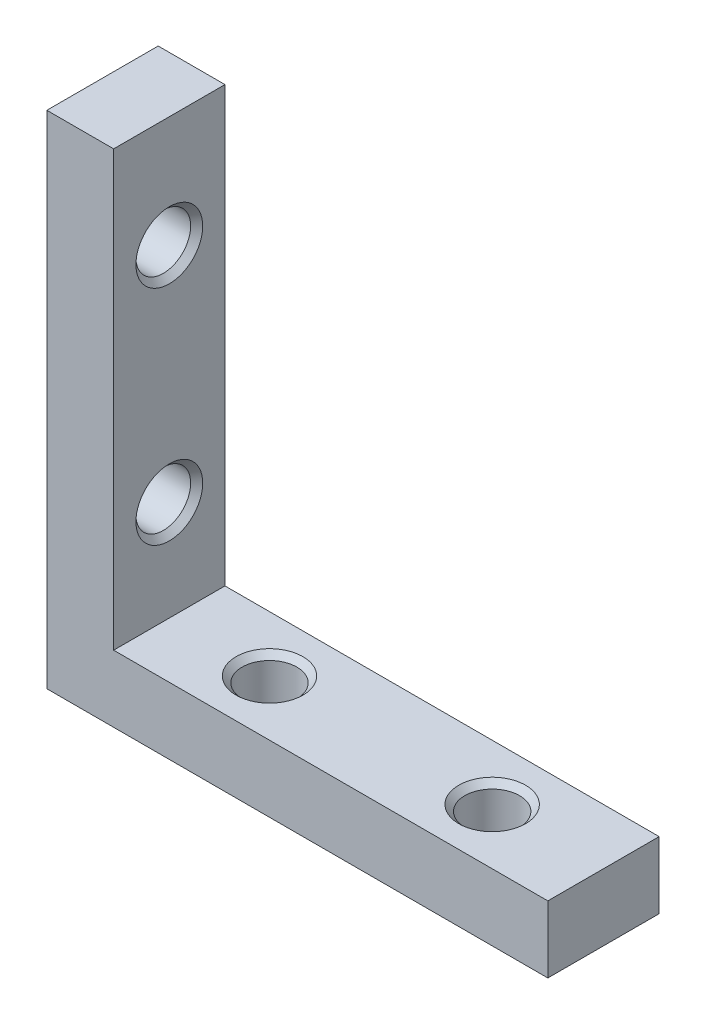
ISO-10303-21;
HEADER;
FILE_DESCRIPTION(('STEP AP214'),'2;1');
FILE_NAME('part.step','',(''),(''),'','','');
FILE_SCHEMA(('AUTOMOTIVE_DESIGN { 1 0 10303 214 1 1 1 1 }'));
ENDSEC;
DATA;
#1=APPLICATION_CONTEXT('core data for automotive mechanical design processes');
#2=APPLICATION_PROTOCOL_DEFINITION('international standard','automotive_design',2000,#1);
#3=PRODUCT_CONTEXT('',#1,'mechanical');
#4=PRODUCT('Part','Part','',(#3));
#5=PRODUCT_RELATED_PRODUCT_CATEGORY('part','',(#4));
#6=PRODUCT_DEFINITION_FORMATION('','',#4);
#7=PRODUCT_DEFINITION_CONTEXT('part definition',#1,'design');
#8=PRODUCT_DEFINITION('design','',#6,#7);
#9=PRODUCT_DEFINITION_SHAPE('','',#8);
#10=(LENGTH_UNIT() NAMED_UNIT(*) SI_UNIT(.MILLI.,.METRE.));
#11=(NAMED_UNIT(*) PLANE_ANGLE_UNIT() SI_UNIT($,.RADIAN.));
#12=(NAMED_UNIT(*) SI_UNIT($,.STERADIAN.) SOLID_ANGLE_UNIT());
#13=UNCERTAINTY_MEASURE_WITH_UNIT(LENGTH_MEASURE(1.E-05),#10,'distance_accuracy_value','');
#14=(GEOMETRIC_REPRESENTATION_CONTEXT(3) GLOBAL_UNCERTAINTY_ASSIGNED_CONTEXT((#13)) GLOBAL_UNIT_ASSIGNED_CONTEXT((#10,
#11,#12)) REPRESENTATION_CONTEXT('',''));
#15=CARTESIAN_POINT('',(0.,0.,0.));
#16=DIRECTION('',(0.,0.,1.));
#17=DIRECTION('',(1.,0.,0.));
#18=AXIS2_PLACEMENT_3D('',#15,#16,#17);
#19=CARTESIAN_POINT('',(45.,3.,0.));
#20=DIRECTION('',(-1.,0.,0.));
#21=DIRECTION('',(0.,0.,1.));
#22=AXIS2_PLACEMENT_3D('',#19,#20,#21);
#23=PLANE('',#22);
#24=DIRECTION('',(0.,0.,-1.));
#25=VECTOR('',#24,1.);
#26=CARTESIAN_POINT('',(45.,0.,0.));
#27=LINE('',#26,#25);
#28=CARTESIAN_POINT('',(45.,0.,5.));
#29=VERTEX_POINT('',#28);
#30=CARTESIAN_POINT('',(45.,0.,-5.));
#31=VERTEX_POINT('',#30);
#32=EDGE_CURVE('E145',#29,#31,#27,.T.);
#33=ORIENTED_EDGE('',*,*,#32,.T.);
#34=DIRECTION('',(0.,-1.,0.));
#35=VECTOR('',#34,1.);
#36=CARTESIAN_POINT('',(45.,3.,-5.));
#37=LINE('',#36,#35);
#38=CARTESIAN_POINT('',(45.,6.,-5.));
#39=VERTEX_POINT('',#38);
#40=EDGE_CURVE('E12',#39,#31,#37,.T.);
#41=ORIENTED_EDGE('',*,*,#40,.F.);
#42=DIRECTION('',(0.,0.,-1.));
#43=VECTOR('',#42,1.);
#44=CARTESIAN_POINT('',(45.,6.,0.));
#45=LINE('',#44,#43);
#46=CARTESIAN_POINT('',(45.,6.,5.));
#47=VERTEX_POINT('',#46);
#48=EDGE_CURVE('E153',#47,#39,#45,.T.);
#49=ORIENTED_EDGE('',*,*,#48,.F.);
#50=DIRECTION('',(0.,1.,0.));
#51=VECTOR('',#50,1.);
#52=CARTESIAN_POINT('',(45.,3.,5.));
#53=LINE('',#52,#51);
#54=EDGE_CURVE('E31',#29,#47,#53,.T.);
#55=ORIENTED_EDGE('',*,*,#54,.F.);
#56=EDGE_LOOP('',(#33,#41,#49,#55));
#57=FACE_BOUND('',#56,.T.);
#58=ADVANCED_FACE('F22',(#57),#23,.F.);
#59=CARTESIAN_POINT('',(22.5,3.,-5.));
#60=DIRECTION('',(0.,0.,1.));
#61=DIRECTION('',(1.,0.,0.));
#62=AXIS2_PLACEMENT_3D('',#59,#60,#61);
#63=PLANE('',#62);
#64=DIRECTION('',(-1.,0.,0.));
#65=VECTOR('',#64,1.);
#66=CARTESIAN_POINT('',(22.5,0.,-5.));
#67=LINE('',#66,#65);
#68=CARTESIAN_POINT('',(0.,0.,-5.));
#69=VERTEX_POINT('',#68);
#70=EDGE_CURVE('E152',#31,#69,#67,.T.);
#71=ORIENTED_EDGE('',*,*,#70,.T.);
#72=DIRECTION('',(0.,1.,0.));
#73=VECTOR('',#72,1.);
#74=CARTESIAN_POINT('',(0.,3.,-5.));
#75=LINE('',#74,#73);
#76=CARTESIAN_POINT('',(0.,45.,-5.));
#77=VERTEX_POINT('',#76);
#78=EDGE_CURVE('E257',#69,#77,#75,.T.);
#79=ORIENTED_EDGE('',*,*,#78,.T.);
#80=DIRECTION('',(1.,0.,0.));
#81=VECTOR('',#80,1.);
#82=CARTESIAN_POINT('',(3.,45.,-5.));
#83=LINE('',#82,#81);
#84=CARTESIAN_POINT('',(6.,45.,-5.));
#85=VERTEX_POINT('',#84);
#86=EDGE_CURVE('E46',#77,#85,#83,.T.);
#87=ORIENTED_EDGE('',*,*,#86,.T.);
#88=DIRECTION('',(0.,-1.,0.));
#89=VECTOR('',#88,1.);
#90=CARTESIAN_POINT('',(6.,22.5,-5.));
#91=LINE('',#90,#89);
#92=CARTESIAN_POINT('',(6.,6.,-5.));
#93=VERTEX_POINT('',#92);
#94=EDGE_CURVE('E254',#85,#93,#91,.T.);
#95=ORIENTED_EDGE('',*,*,#94,.T.);
#96=DIRECTION('',(1.,0.,0.));
#97=VECTOR('',#96,1.);
#98=CARTESIAN_POINT('',(22.5,6.,-5.));
#99=LINE('',#98,#97);
#100=EDGE_CURVE('E160',#93,#39,#99,.T.);
#101=ORIENTED_EDGE('',*,*,#100,.T.);
#102=ORIENTED_EDGE('',*,*,#40,.T.);
#103=EDGE_LOOP('',(#71,#79,#87,#95,#101,#102));
#104=FACE_BOUND('',#103,.T.);
#105=ADVANCED_FACE('F296',(#104),#63,.F.);
#106=CARTESIAN_POINT('',(22.5,3.,5.));
#107=DIRECTION('',(0.,0.,1.));
#108=DIRECTION('',(1.,0.,0.));
#109=AXIS2_PLACEMENT_3D('',#106,#107,#108);
#110=PLANE('',#109);
#111=DIRECTION('',(-1.,0.,0.));
#112=VECTOR('',#111,1.);
#113=CARTESIAN_POINT('',(22.5,6.,5.));
#114=LINE('',#113,#112);
#115=CARTESIAN_POINT('',(6.,6.,5.));
#116=VERTEX_POINT('',#115);
#117=EDGE_CURVE('E159',#47,#116,#114,.T.);
#118=ORIENTED_EDGE('',*,*,#117,.T.);
#119=DIRECTION('',(0.,1.,0.));
#120=VECTOR('',#119,1.);
#121=CARTESIAN_POINT('',(6.,22.5,5.));
#122=LINE('',#121,#120);
#123=CARTESIAN_POINT('',(6.,45.,5.));
#124=VERTEX_POINT('',#123);
#125=EDGE_CURVE('E247',#116,#124,#122,.T.);
#126=ORIENTED_EDGE('',*,*,#125,.T.);
#127=DIRECTION('',(-1.,0.,0.));
#128=VECTOR('',#127,1.);
#129=CARTESIAN_POINT('',(3.,45.,5.));
#130=LINE('',#129,#128);
#131=CARTESIAN_POINT('',(0.,45.,5.));
#132=VERTEX_POINT('',#131);
#133=EDGE_CURVE('E25',#124,#132,#130,.T.);
#134=ORIENTED_EDGE('',*,*,#133,.T.);
#135=DIRECTION('',(0.,-1.,0.));
#136=VECTOR('',#135,1.);
#137=CARTESIAN_POINT('',(0.,22.5,5.));
#138=LINE('',#137,#136);
#139=CARTESIAN_POINT('',(0.,0.,5.));
#140=VERTEX_POINT('',#139);
#141=EDGE_CURVE('E263',#132,#140,#138,.T.);
#142=ORIENTED_EDGE('',*,*,#141,.T.);
#143=DIRECTION('',(1.,0.,0.));
#144=VECTOR('',#143,1.);
#145=CARTESIAN_POINT('',(22.5,0.,5.));
#146=LINE('',#145,#144);
#147=EDGE_CURVE('E210',#140,#29,#146,.T.);
#148=ORIENTED_EDGE('',*,*,#147,.T.);
#149=ORIENTED_EDGE('',*,*,#54,.T.);
#150=EDGE_LOOP('',(#118,#126,#134,#142,#148,#149));
#151=FACE_BOUND('',#150,.T.);
#152=ADVANCED_FACE('F300',(#151),#110,.T.);
#153=CARTESIAN_POINT('',(3.,45.,0.));
#154=DIRECTION('',(0.,-1.,0.));
#155=DIRECTION('',(0.,0.,-1.));
#156=AXIS2_PLACEMENT_3D('',#153,#154,#155);
#157=PLANE('',#156);
#158=DIRECTION('',(0.,0.,-1.));
#159=VECTOR('',#158,1.);
#160=CARTESIAN_POINT('',(6.,45.,0.));
#161=LINE('',#160,#159);
#162=EDGE_CURVE('E249',#124,#85,#161,.T.);
#163=ORIENTED_EDGE('',*,*,#162,.T.);
#164=ORIENTED_EDGE('',*,*,#86,.F.);
#165=DIRECTION('',(0.,0.,-1.));
#166=VECTOR('',#165,1.);
#167=CARTESIAN_POINT('',(0.,45.,0.));
#168=LINE('',#167,#166);
#169=EDGE_CURVE('E260',#132,#77,#168,.T.);
#170=ORIENTED_EDGE('',*,*,#169,.F.);
#171=ORIENTED_EDGE('',*,*,#133,.F.);
#172=EDGE_LOOP('',(#163,#164,#170,#171));
#173=FACE_BOUND('',#172,.T.);
#174=ADVANCED_FACE('F319',(#173),#157,.F.);
#175=CARTESIAN_POINT('',(6.,22.5,0.));
#176=DIRECTION('',(-1.,0.,0.));
#177=DIRECTION('',(0.,0.,1.));
#178=AXIS2_PLACEMENT_3D('',#175,#176,#177);
#179=PLANE('',#178);
#180=CARTESIAN_POINT('',(6.,15.,0.));
#181=DIRECTION('',(-1.,0.,0.));
#182=DIRECTION('',(0.,1.,0.));
#183=AXIS2_PLACEMENT_3D('',#180,#181,#182);
#184=CIRCLE('',#183,3.);
#185=CARTESIAN_POINT('',(6.,18.,0.));
#186=VERTEX_POINT('',#185);
#187=EDGE_CURVE('E169',#186,#186,#184,.T.);
#188=ORIENTED_EDGE('',*,*,#187,.T.);
#189=EDGE_LOOP('',(#188));
#190=FACE_BOUND('',#189,.T.);
#191=CARTESIAN_POINT('',(6.,35.,0.));
#192=DIRECTION('',(-1.,0.,0.));
#193=DIRECTION('',(0.,1.,0.));
#194=AXIS2_PLACEMENT_3D('',#191,#192,#193);
#195=CIRCLE('',#194,3.);
#196=CARTESIAN_POINT('',(6.,38.,0.));
#197=VERTEX_POINT('',#196);
#198=EDGE_CURVE('E134',#197,#197,#195,.T.);
#199=ORIENTED_EDGE('',*,*,#198,.T.);
#200=EDGE_LOOP('',(#199));
#201=FACE_BOUND('',#200,.T.);
#202=DIRECTION('',(0.,0.,1.));
#203=VECTOR('',#202,1.);
#204=CARTESIAN_POINT('',(6.,6.,0.));
#205=LINE('',#204,#203);
#206=EDGE_CURVE('E151',#93,#116,#205,.T.);
#207=ORIENTED_EDGE('',*,*,#206,.F.);
#208=ORIENTED_EDGE('',*,*,#94,.F.);
#209=ORIENTED_EDGE('',*,*,#162,.F.);
#210=ORIENTED_EDGE('',*,*,#125,.F.);
#211=EDGE_LOOP('',(#207,#208,#209,#210));
#212=FACE_BOUND('',#211,.T.);
#213=ADVANCED_FACE('F318',(#190,#201,#212),#179,.F.);
#214=CARTESIAN_POINT('',(0.,3.,0.));
#215=DIRECTION('',(1.,0.,0.));
#216=DIRECTION('',(0.,0.,-1.));
#217=AXIS2_PLACEMENT_3D('',#214,#215,#216);
#218=PLANE('',#217);
#219=CARTESIAN_POINT('',(0.,15.,0.));
#220=DIRECTION('',(1.,0.,0.));
#221=DIRECTION('',(0.,1.,0.));
#222=AXIS2_PLACEMENT_3D('',#219,#220,#221);
#223=CIRCLE('',#222,3.);
#224=CARTESIAN_POINT('',(0.,18.,0.));
#225=VERTEX_POINT('',#224);
#226=EDGE_CURVE('E193',#225,#225,#223,.T.);
#227=ORIENTED_EDGE('',*,*,#226,.T.);
#228=EDGE_LOOP('',(#227));
#229=FACE_BOUND('',#228,.T.);
#230=CARTESIAN_POINT('',(0.,35.,0.));
#231=DIRECTION('',(1.,0.,0.));
#232=DIRECTION('',(0.,1.,0.));
#233=AXIS2_PLACEMENT_3D('',#230,#231,#232);
#234=CIRCLE('',#233,3.);
#235=CARTESIAN_POINT('',(0.,38.,0.));
#236=VERTEX_POINT('',#235);
#237=EDGE_CURVE('E181',#236,#236,#234,.T.);
#238=ORIENTED_EDGE('',*,*,#237,.T.);
#239=EDGE_LOOP('',(#238));
#240=FACE_BOUND('',#239,.T.);
#241=ORIENTED_EDGE('',*,*,#141,.F.);
#242=ORIENTED_EDGE('',*,*,#169,.T.);
#243=ORIENTED_EDGE('',*,*,#78,.F.);
#244=DIRECTION('',(0.,0.,-1.));
#245=VECTOR('',#244,1.);
#246=CARTESIAN_POINT('',(0.,0.,0.));
#247=LINE('',#246,#245);
#248=EDGE_CURVE('E222',#140,#69,#247,.T.);
#249=ORIENTED_EDGE('',*,*,#248,.F.);
#250=EDGE_LOOP('',(#241,#242,#243,#249));
#251=FACE_BOUND('',#250,.T.);
#252=ADVANCED_FACE('F275',(#229,#240,#251),#218,.F.);
#253=CARTESIAN_POINT('',(5.729375,35.,0.));
#254=DIRECTION('',(1.,0.,0.));
#255=DIRECTION('',(0.,1.,0.));
#256=AXIS2_PLACEMENT_3D('',#253,#254,#255);
#257=CONICAL_SURFACE('',#256,2.729375,0.785398163397448);
#258=CARTESIAN_POINT('',(5.45875,35.,0.));
#259=DIRECTION('',(1.,0.,0.));
#260=DIRECTION('',(0.,1.,0.));
#261=AXIS2_PLACEMENT_3D('',#258,#259,#260);
#262=CIRCLE('',#261,2.45875);
#263=CARTESIAN_POINT('',(5.45875,37.45875,0.));
#264=VERTEX_POINT('',#263);
#265=EDGE_CURVE('E266',#264,#264,#262,.T.);
#266=ORIENTED_EDGE('',*,*,#265,.F.);
#267=EDGE_LOOP('',(#266));
#268=FACE_BOUND('',#267,.T.);
#269=ORIENTED_EDGE('',*,*,#198,.F.);
#270=EDGE_LOOP('',(#269));
#271=FACE_BOUND('',#270,.T.);
#272=ADVANCED_FACE('F287',(#268,#271),#257,.F.);
#273=CARTESIAN_POINT('',(3.,35.,0.));
#274=DIRECTION('',(-1.,0.,0.));
#275=DIRECTION('',(0.,1.,0.));
#276=AXIS2_PLACEMENT_3D('',#273,#274,#275);
#277=CYLINDRICAL_SURFACE('',#276,2.45875);
#278=CARTESIAN_POINT('',(0.54125,35.,0.));
#279=DIRECTION('',(1.,0.,0.));
#280=DIRECTION('',(0.,1.,0.));
#281=AXIS2_PLACEMENT_3D('',#278,#279,#280);
#282=CIRCLE('',#281,2.45875);
#283=CARTESIAN_POINT('',(0.54125,37.45875,0.));
#284=VERTEX_POINT('',#283);
#285=EDGE_CURVE('E174',#284,#284,#282,.T.);
#286=ORIENTED_EDGE('',*,*,#285,.F.);
#287=EDGE_LOOP('',(#286));
#288=FACE_BOUND('',#287,.T.);
#289=ORIENTED_EDGE('',*,*,#265,.T.);
#290=EDGE_LOOP('',(#289));
#291=FACE_BOUND('',#290,.T.);
#292=ADVANCED_FACE('F282',(#288,#291),#277,.F.);
#293=CARTESIAN_POINT('',(0.270625,35.,0.));
#294=DIRECTION('',(-1.,0.,0.));
#295=DIRECTION('',(0.,1.,0.));
#296=AXIS2_PLACEMENT_3D('',#293,#294,#295);
#297=CONICAL_SURFACE('',#296,2.729375,0.785398163397448);
#298=ORIENTED_EDGE('',*,*,#237,.F.);
#299=EDGE_LOOP('',(#298));
#300=FACE_BOUND('',#299,.T.);
#301=ORIENTED_EDGE('',*,*,#285,.T.);
#302=EDGE_LOOP('',(#301));
#303=FACE_BOUND('',#302,.T.);
#304=ADVANCED_FACE('F278',(#300,#303),#297,.F.);
#305=CARTESIAN_POINT('',(5.729375,15.,0.));
#306=DIRECTION('',(1.,0.,0.));
#307=DIRECTION('',(0.,1.,0.));
#308=AXIS2_PLACEMENT_3D('',#305,#306,#307);
#309=CONICAL_SURFACE('',#308,2.729375,0.785398163397448);
#310=CARTESIAN_POINT('',(5.45875,15.,0.));
#311=DIRECTION('',(1.,0.,0.));
#312=DIRECTION('',(0.,1.,0.));
#313=AXIS2_PLACEMENT_3D('',#310,#311,#312);
#314=CIRCLE('',#313,2.45875);
#315=CARTESIAN_POINT('',(5.45875,17.45875,0.));
#316=VERTEX_POINT('',#315);
#317=EDGE_CURVE('E175',#316,#316,#314,.T.);
#318=ORIENTED_EDGE('',*,*,#317,.F.);
#319=EDGE_LOOP('',(#318));
#320=FACE_BOUND('',#319,.T.);
#321=ORIENTED_EDGE('',*,*,#187,.F.);
#322=EDGE_LOOP('',(#321));
#323=FACE_BOUND('',#322,.T.);
#324=ADVANCED_FACE('F281',(#320,#323),#309,.F.);
#325=CARTESIAN_POINT('',(3.,15.,0.));
#326=DIRECTION('',(-1.,0.,0.));
#327=DIRECTION('',(0.,1.,0.));
#328=AXIS2_PLACEMENT_3D('',#325,#326,#327);
#329=CYLINDRICAL_SURFACE('',#328,2.45875);
#330=CARTESIAN_POINT('',(0.54125,15.,0.));
#331=DIRECTION('',(1.,0.,0.));
#332=DIRECTION('',(0.,1.,0.));
#333=AXIS2_PLACEMENT_3D('',#330,#331,#332);
#334=CIRCLE('',#333,2.45875);
#335=CARTESIAN_POINT('',(0.54125,17.45875,0.));
#336=VERTEX_POINT('',#335);
#337=EDGE_CURVE('E190',#336,#336,#334,.T.);
#338=ORIENTED_EDGE('',*,*,#337,.F.);
#339=EDGE_LOOP('',(#338));
#340=FACE_BOUND('',#339,.T.);
#341=ORIENTED_EDGE('',*,*,#317,.T.);
#342=EDGE_LOOP('',(#341));
#343=FACE_BOUND('',#342,.T.);
#344=ADVANCED_FACE('F330',(#340,#343),#329,.F.);
#345=CARTESIAN_POINT('',(0.270625,15.,0.));
#346=DIRECTION('',(-1.,0.,0.));
#347=DIRECTION('',(0.,1.,0.));
#348=AXIS2_PLACEMENT_3D('',#345,#346,#347);
#349=CONICAL_SURFACE('',#348,2.729375,0.785398163397448);
#350=ORIENTED_EDGE('',*,*,#226,.F.);
#351=EDGE_LOOP('',(#350));
#352=FACE_BOUND('',#351,.T.);
#353=ORIENTED_EDGE('',*,*,#337,.T.);
#354=EDGE_LOOP('',(#353));
#355=FACE_BOUND('',#354,.T.);
#356=ADVANCED_FACE('F335',(#352,#355),#349,.F.);
#357=CARTESIAN_POINT('',(22.5,6.,0.));
#358=DIRECTION('',(0.,-1.,0.));
#359=DIRECTION('',(0.,0.,-1.));
#360=AXIS2_PLACEMENT_3D('',#357,#358,#359);
#361=PLANE('',#360);
#362=CARTESIAN_POINT('',(15.,6.,0.));
#363=DIRECTION('',(0.,-1.,0.));
#364=DIRECTION('',(1.,0.,0.));
#365=AXIS2_PLACEMENT_3D('',#362,#363,#364);
#366=CIRCLE('',#365,3.);
#367=CARTESIAN_POINT('',(18.,6.,0.));
#368=VERTEX_POINT('',#367);
#369=EDGE_CURVE('E204',#368,#368,#366,.T.);
#370=ORIENTED_EDGE('',*,*,#369,.T.);
#371=EDGE_LOOP('',(#370));
#372=FACE_BOUND('',#371,.T.);
#373=CARTESIAN_POINT('',(35.,6.,0.));
#374=DIRECTION('',(0.,-1.,0.));
#375=DIRECTION('',(1.,0.,0.));
#376=AXIS2_PLACEMENT_3D('',#373,#374,#375);
#377=CIRCLE('',#376,3.);
#378=CARTESIAN_POINT('',(38.,6.,0.));
#379=VERTEX_POINT('',#378);
#380=EDGE_CURVE('E221',#379,#379,#377,.T.);
#381=ORIENTED_EDGE('',*,*,#380,.T.);
#382=EDGE_LOOP('',(#381));
#383=FACE_BOUND('',#382,.T.);
#384=ORIENTED_EDGE('',*,*,#206,.T.);
#385=ORIENTED_EDGE('',*,*,#117,.F.);
#386=ORIENTED_EDGE('',*,*,#48,.T.);
#387=ORIENTED_EDGE('',*,*,#100,.F.);
#388=EDGE_LOOP('',(#384,#385,#386,#387));
#389=FACE_BOUND('',#388,.T.);
#390=ADVANCED_FACE('F311',(#372,#383,#389),#361,.F.);
#391=CARTESIAN_POINT('',(22.5,0.,0.));
#392=DIRECTION('',(0.,1.,0.));
#393=DIRECTION('',(0.,0.,1.));
#394=AXIS2_PLACEMENT_3D('',#391,#392,#393);
#395=PLANE('',#394);
#396=CARTESIAN_POINT('',(15.,0.,0.));
#397=DIRECTION('',(0.,1.,0.));
#398=DIRECTION('',(1.,0.,0.));
#399=AXIS2_PLACEMENT_3D('',#396,#397,#398);
#400=CIRCLE('',#399,3.);
#401=CARTESIAN_POINT('',(18.,0.,0.));
#402=VERTEX_POINT('',#401);
#403=EDGE_CURVE('E126',#402,#402,#400,.T.);
#404=ORIENTED_EDGE('',*,*,#403,.T.);
#405=EDGE_LOOP('',(#404));
#406=FACE_BOUND('',#405,.T.);
#407=CARTESIAN_POINT('',(35.,0.,0.));
#408=DIRECTION('',(0.,1.,0.));
#409=DIRECTION('',(1.,0.,0.));
#410=AXIS2_PLACEMENT_3D('',#407,#408,#409);
#411=CIRCLE('',#410,3.);
#412=CARTESIAN_POINT('',(38.,0.,0.));
#413=VERTEX_POINT('',#412);
#414=EDGE_CURVE('E215',#413,#413,#411,.T.);
#415=ORIENTED_EDGE('',*,*,#414,.T.);
#416=EDGE_LOOP('',(#415));
#417=FACE_BOUND('',#416,.T.);
#418=ORIENTED_EDGE('',*,*,#147,.F.);
#419=ORIENTED_EDGE('',*,*,#248,.T.);
#420=ORIENTED_EDGE('',*,*,#70,.F.);
#421=ORIENTED_EDGE('',*,*,#32,.F.);
#422=EDGE_LOOP('',(#418,#419,#420,#421));
#423=FACE_BOUND('',#422,.T.);
#424=ADVANCED_FACE('F303',(#406,#417,#423),#395,.F.);
#425=CARTESIAN_POINT('',(35.,5.729375,0.));
#426=DIRECTION('',(0.,1.,0.));
#427=DIRECTION('',(1.,0.,0.));
#428=AXIS2_PLACEMENT_3D('',#425,#426,#427);
#429=CONICAL_SURFACE('',#428,2.729375,0.785398163397448);
#430=CARTESIAN_POINT('',(35.,5.45875,0.));
#431=DIRECTION('',(0.,1.,0.));
#432=DIRECTION('',(1.,0.,0.));
#433=AXIS2_PLACEMENT_3D('',#430,#431,#432);
#434=CIRCLE('',#433,2.45875);
#435=CARTESIAN_POINT('',(37.45875,5.45875,0.));
#436=VERTEX_POINT('',#435);
#437=EDGE_CURVE('E218',#436,#436,#434,.T.);
#438=ORIENTED_EDGE('',*,*,#437,.F.);
#439=EDGE_LOOP('',(#438));
#440=FACE_BOUND('',#439,.T.);
#441=ORIENTED_EDGE('',*,*,#380,.F.);
#442=EDGE_LOOP('',(#441));
#443=FACE_BOUND('',#442,.T.);
#444=ADVANCED_FACE('F363',(#440,#443),#429,.F.);
#445=CARTESIAN_POINT('',(35.,3.,0.));
#446=DIRECTION('',(0.,-1.,0.));
#447=DIRECTION('',(1.,0.,0.));
#448=AXIS2_PLACEMENT_3D('',#445,#446,#447);
#449=CYLINDRICAL_SURFACE('',#448,2.45875);
#450=CARTESIAN_POINT('',(35.,0.541249999999992,0.));
#451=DIRECTION('',(0.,1.,0.));
#452=DIRECTION('',(1.,0.,0.));
#453=AXIS2_PLACEMENT_3D('',#450,#451,#452);
#454=CIRCLE('',#453,2.45875);
#455=CARTESIAN_POINT('',(37.45875,0.541249999999992,0.));
#456=VERTEX_POINT('',#455);
#457=EDGE_CURVE('E209',#456,#456,#454,.T.);
#458=ORIENTED_EDGE('',*,*,#457,.F.);
#459=EDGE_LOOP('',(#458));
#460=FACE_BOUND('',#459,.T.);
#461=ORIENTED_EDGE('',*,*,#437,.T.);
#462=EDGE_LOOP('',(#461));
#463=FACE_BOUND('',#462,.T.);
#464=ADVANCED_FACE('F359',(#460,#463),#449,.F.);
#465=CARTESIAN_POINT('',(35.,0.270624999999993,0.));
#466=DIRECTION('',(0.,-1.,0.));
#467=DIRECTION('',(1.,0.,0.));
#468=AXIS2_PLACEMENT_3D('',#465,#466,#467);
#469=CONICAL_SURFACE('',#468,2.729375,0.785398163397448);
#470=ORIENTED_EDGE('',*,*,#414,.F.);
#471=EDGE_LOOP('',(#470));
#472=FACE_BOUND('',#471,.T.);
#473=ORIENTED_EDGE('',*,*,#457,.T.);
#474=EDGE_LOOP('',(#473));
#475=FACE_BOUND('',#474,.T.);
#476=ADVANCED_FACE('F362',(#472,#475),#469,.F.);
#477=CARTESIAN_POINT('',(15.,5.729375,0.));
#478=DIRECTION('',(0.,1.,0.));
#479=DIRECTION('',(1.,0.,0.));
#480=AXIS2_PLACEMENT_3D('',#477,#478,#479);
#481=CONICAL_SURFACE('',#480,2.729375,0.785398163397448);
#482=CARTESIAN_POINT('',(15.,5.45875,0.));
#483=DIRECTION('',(0.,1.,0.));
#484=DIRECTION('',(1.,0.,0.));
#485=AXIS2_PLACEMENT_3D('',#482,#483,#484);
#486=CIRCLE('',#485,2.45875);
#487=CARTESIAN_POINT('',(17.45875,5.45875,0.));
#488=VERTEX_POINT('',#487);
#489=EDGE_CURVE('E130',#488,#488,#486,.T.);
#490=ORIENTED_EDGE('',*,*,#489,.F.);
#491=EDGE_LOOP('',(#490));
#492=FACE_BOUND('',#491,.T.);
#493=ORIENTED_EDGE('',*,*,#369,.F.);
#494=EDGE_LOOP('',(#493));
#495=FACE_BOUND('',#494,.T.);
#496=ADVANCED_FACE('F367',(#492,#495),#481,.F.);
#497=CARTESIAN_POINT('',(15.,3.,0.));
#498=DIRECTION('',(0.,-1.,0.));
#499=DIRECTION('',(1.,0.,0.));
#500=AXIS2_PLACEMENT_3D('',#497,#498,#499);
#501=CYLINDRICAL_SURFACE('',#500,2.45875);
#502=CARTESIAN_POINT('',(15.,0.54125,0.));
#503=DIRECTION('',(0.,1.,0.));
#504=DIRECTION('',(1.,0.,0.));
#505=AXIS2_PLACEMENT_3D('',#502,#503,#504);
#506=CIRCLE('',#505,2.45875);
#507=CARTESIAN_POINT('',(17.45875,0.54125,0.));
#508=VERTEX_POINT('',#507);
#509=EDGE_CURVE('E122',#508,#508,#506,.T.);
#510=ORIENTED_EDGE('',*,*,#509,.F.);
#511=EDGE_LOOP('',(#510));
#512=FACE_BOUND('',#511,.T.);
#513=ORIENTED_EDGE('',*,*,#489,.T.);
#514=EDGE_LOOP('',(#513));
#515=FACE_BOUND('',#514,.T.);
#516=ADVANCED_FACE('F371',(#512,#515),#501,.F.);
#517=CARTESIAN_POINT('',(15.,0.270625,0.));
#518=DIRECTION('',(0.,-1.,0.));
#519=DIRECTION('',(1.,0.,0.));
#520=AXIS2_PLACEMENT_3D('',#517,#518,#519);
#521=CONICAL_SURFACE('',#520,2.729375,0.785398163397448);
#522=ORIENTED_EDGE('',*,*,#403,.F.);
#523=EDGE_LOOP('',(#522));
#524=FACE_BOUND('',#523,.T.);
#525=ORIENTED_EDGE('',*,*,#509,.T.);
#526=EDGE_LOOP('',(#525));
#527=FACE_BOUND('',#526,.T.);
#528=ADVANCED_FACE('F123',(#524,#527),#521,.F.);
#529=CLOSED_SHELL('',(#58,#105,#152,#174,#213,#252,#272,#292,#304,#324,#344,#356,#390,#424,#444,
#464,#476,#496,#516,#528));
#530=MANIFOLD_SOLID_BREP('B1',#529);
#531=ADVANCED_BREP_SHAPE_REPRESENTATION('',(#18,#530),#14);
#532=SHAPE_DEFINITION_REPRESENTATION(#9,#531);
ENDSEC;
END-ISO-10303-21;
